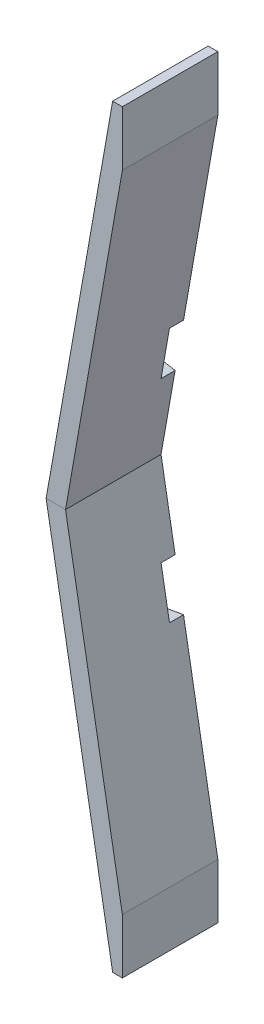
ISO-10303-21;
HEADER;
FILE_DESCRIPTION(('STEP AP214'),'2;1');
FILE_NAME('part.step','',(''),(''),'','','');
FILE_SCHEMA(('AUTOMOTIVE_DESIGN { 1 0 10303 214 1 1 1 1 }'));
ENDSEC;
DATA;
#1=APPLICATION_CONTEXT('core data for automotive mechanical design processes');
#2=APPLICATION_PROTOCOL_DEFINITION('international standard','automotive_design',2000,#1);
#3=PRODUCT_CONTEXT('',#1,'mechanical');
#4=PRODUCT('Part','Part','',(#3));
#5=PRODUCT_RELATED_PRODUCT_CATEGORY('part','',(#4));
#6=PRODUCT_DEFINITION_FORMATION('','',#4);
#7=PRODUCT_DEFINITION_CONTEXT('part definition',#1,'design');
#8=PRODUCT_DEFINITION('design','',#6,#7);
#9=PRODUCT_DEFINITION_SHAPE('','',#8);
#10=(LENGTH_UNIT() NAMED_UNIT(*) SI_UNIT(.MILLI.,.METRE.));
#11=(NAMED_UNIT(*) PLANE_ANGLE_UNIT() SI_UNIT($,.RADIAN.));
#12=(NAMED_UNIT(*) SI_UNIT($,.STERADIAN.) SOLID_ANGLE_UNIT());
#13=UNCERTAINTY_MEASURE_WITH_UNIT(LENGTH_MEASURE(1.E-05),#10,'distance_accuracy_value','');
#14=(GEOMETRIC_REPRESENTATION_CONTEXT(3) GLOBAL_UNCERTAINTY_ASSIGNED_CONTEXT((#13)) GLOBAL_UNIT_ASSIGNED_CONTEXT((#10,
#11,#12)) REPRESENTATION_CONTEXT('',''));
#15=CARTESIAN_POINT('',(0.,0.,0.));
#16=DIRECTION('',(0.,0.,1.));
#17=DIRECTION('',(1.,0.,0.));
#18=AXIS2_PLACEMENT_3D('',#15,#16,#17);
#19=CARTESIAN_POINT('',(-90.8989782521974,0.,-20.));
#20=DIRECTION('',(-0.984807753012208,0.173648177666931,0.));
#21=DIRECTION('',(0.173648177666931,0.984807753012208,0.));
#22=AXIS2_PLACEMENT_3D('',#19,#20,#21);
#23=PLANE('',#22);
#24=DIRECTION('',(0.,0.,1.));
#25=VECTOR('',#24,1.);
#26=CARTESIAN_POINT('',(-87.9530903883168,16.706960285058,-20.));
#27=LINE('',#26,#25);
#28=CARTESIAN_POINT('',(-87.9530903883168,16.706960285058,-20.));
#29=VERTEX_POINT('',#28);
#30=CARTESIAN_POINT('',(-87.9530903883168,16.706960285058,-17.06));
#31=VERTEX_POINT('',#30);
#32=EDGE_CURVE('E177',#29,#31,#27,.T.);
#33=ORIENTED_EDGE('',*,*,#32,.T.);
#34=DIRECTION('',(-0.173648177666931,-0.984807753012208,0.));
#35=VECTOR('',#34,1.);
#36=CARTESIAN_POINT('',(-90.8989782521974,0.,-17.06));
#37=LINE('',#36,#35);
#38=CARTESIAN_POINT('',(-86.1888249032208,26.712607055662,-17.06));
#39=VERTEX_POINT('',#38);
#40=EDGE_CURVE('E140',#39,#31,#37,.T.);
#41=ORIENTED_EDGE('',*,*,#40,.F.);
#42=DIRECTION('',(0.,0.,-1.));
#43=VECTOR('',#42,1.);
#44=CARTESIAN_POINT('',(-86.1888249032208,26.712607055662,-20.));
#45=LINE('',#44,#43);
#46=CARTESIAN_POINT('',(-86.1888249032208,26.712607055662,-20.));
#47=VERTEX_POINT('',#46);
#48=EDGE_CURVE('E128',#39,#47,#45,.T.);
#49=ORIENTED_EDGE('',*,*,#48,.T.);
#50=DIRECTION('',(0.173648177666931,0.984807753012208,0.));
#51=VECTOR('',#50,1.);
#52=CARTESIAN_POINT('',(-90.8989782521974,0.,-20.));
#53=LINE('',#52,#51);
#54=CARTESIAN_POINT('',(-79.,67.4824590337129,-20.));
#55=VERTEX_POINT('',#54);
#56=EDGE_CURVE('E110',#47,#55,#53,.T.);
#57=ORIENTED_EDGE('',*,*,#56,.T.);
#58=DIRECTION('',(0.,0.,1.));
#59=VECTOR('',#58,1.);
#60=CARTESIAN_POINT('',(-79.,67.4824590337129,-20.));
#61=LINE('',#60,#59);
#62=CARTESIAN_POINT('',(-79.,67.4824590337129,0.));
#63=VERTEX_POINT('',#62);
#64=EDGE_CURVE('E117',#55,#63,#61,.T.);
#65=ORIENTED_EDGE('',*,*,#64,.T.);
#66=DIRECTION('',(0.173648177666931,0.984807753012208,0.));
#67=VECTOR('',#66,1.);
#68=CARTESIAN_POINT('',(-90.8989782521974,0.,0.));
#69=LINE('',#68,#67);
#70=CARTESIAN_POINT('',(-90.8989782521974,0.,0.));
#71=VERTEX_POINT('',#70);
#72=EDGE_CURVE('E139',#71,#63,#69,.T.);
#73=ORIENTED_EDGE('',*,*,#72,.F.);
#74=DIRECTION('',(0.,0.,1.));
#75=VECTOR('',#74,1.);
#76=CARTESIAN_POINT('',(-90.8989782521974,0.,-20.));
#77=LINE('',#76,#75);
#78=CARTESIAN_POINT('',(-90.8989782521974,0.,-20.));
#79=VERTEX_POINT('',#78);
#80=EDGE_CURVE('E123',#79,#71,#77,.T.);
#81=ORIENTED_EDGE('',*,*,#80,.F.);
#82=EDGE_CURVE('E114',#79,#29,#53,.T.);
#83=ORIENTED_EDGE('',*,*,#82,.T.);
#84=EDGE_LOOP('',(#33,#41,#49,#57,#65,#73,#81,#83));
#85=FACE_BOUND('',#84,.T.);
#86=ADVANCED_FACE('F43',(#85),#23,.F.);
#87=CARTESIAN_POINT('',(-94.8994469819932,0.347296355333863,-20.));
#88=DIRECTION('',(-0.984807753012207,0.173648177666936,0.));
#89=DIRECTION('',(0.173648177666936,0.984807753012207,0.));
#90=AXIS2_PLACEMENT_3D('',#87,#88,#89);
#91=PLANE('',#90);
#92=DIRECTION('',(-0.173648177666936,-0.984807753012207,0.));
#93=VECTOR('',#92,1.);
#94=CARTESIAN_POINT('',(-94.8994469819932,0.347296355333863,-20.));
#95=LINE('',#94,#93);
#96=CARTESIAN_POINT('',(-91.8923214003656,17.4015529957257,-20.));
#97=VERTEX_POINT('',#96);
#98=CARTESIAN_POINT('',(-94.9606846997403,0.,-20.));
#99=VERTEX_POINT('',#98);
#100=EDGE_CURVE('E147',#97,#99,#95,.T.);
#101=ORIENTED_EDGE('',*,*,#100,.T.);
#102=DIRECTION('',(0.,0.,1.));
#103=VECTOR('',#102,1.);
#104=CARTESIAN_POINT('',(-94.9606846997403,0.,-20.));
#105=LINE('',#104,#103);
#106=CARTESIAN_POINT('',(-94.9606846997403,0.,0.));
#107=VERTEX_POINT('',#106);
#108=EDGE_CURVE('E152',#99,#107,#105,.T.);
#109=ORIENTED_EDGE('',*,*,#108,.T.);
#110=DIRECTION('',(0.173648177666936,0.984807753012207,0.));
#111=VECTOR('',#110,1.);
#112=CARTESIAN_POINT('',(-94.8994469819932,0.347296355333863,0.));
#113=LINE('',#112,#111);
#114=CARTESIAN_POINT('',(-81.0308532237711,79.,0.));
#115=VERTEX_POINT('',#114);
#116=EDGE_CURVE('E144',#107,#115,#113,.T.);
#117=ORIENTED_EDGE('',*,*,#116,.T.);
#118=DIRECTION('',(0.,0.,1.));
#119=VECTOR('',#118,1.);
#120=CARTESIAN_POINT('',(-81.0308532237711,79.,-20.));
#121=LINE('',#120,#119);
#122=CARTESIAN_POINT('',(-81.0308532237711,79.,-20.));
#123=VERTEX_POINT('',#122);
#124=EDGE_CURVE('E136',#123,#115,#121,.T.);
#125=ORIENTED_EDGE('',*,*,#124,.F.);
#126=CARTESIAN_POINT('',(-90.1280559152695,27.4071997663298,-20.));
#127=VERTEX_POINT('',#126);
#128=EDGE_CURVE('E131',#123,#127,#95,.T.);
#129=ORIENTED_EDGE('',*,*,#128,.T.);
#130=DIRECTION('',(0.,0.,-1.));
#131=VECTOR('',#130,1.);
#132=CARTESIAN_POINT('',(-90.1280559152695,27.4071997663297,0.));
#133=LINE('',#132,#131);
#134=CARTESIAN_POINT('',(-90.1280559152695,27.4071997663297,-17.06));
#135=VERTEX_POINT('',#134);
#136=EDGE_CURVE('E162',#135,#127,#133,.T.);
#137=ORIENTED_EDGE('',*,*,#136,.F.);
#138=DIRECTION('',(-0.173648177666936,-0.984807753012207,0.));
#139=VECTOR('',#138,1.);
#140=CARTESIAN_POINT('',(-92.0972696884316,16.239233495655,-17.06));
#141=LINE('',#140,#139);
#142=CARTESIAN_POINT('',(-91.8923214003656,17.4015529957257,-17.06));
#143=VERTEX_POINT('',#142);
#144=EDGE_CURVE('E169',#135,#143,#141,.T.);
#145=ORIENTED_EDGE('',*,*,#144,.T.);
#146=DIRECTION('',(0.,0.,1.));
#147=VECTOR('',#146,1.);
#148=CARTESIAN_POINT('',(-91.8923214003656,17.4015529957257,0.));
#149=LINE('',#148,#147);
#150=EDGE_CURVE('E170',#97,#143,#149,.T.);
#151=ORIENTED_EDGE('',*,*,#150,.F.);
#152=EDGE_LOOP('',(#101,#109,#117,#125,#129,#137,#145,#151));
#153=FACE_BOUND('',#152,.T.);
#154=ADVANCED_FACE('F173',(#153),#91,.T.);
#155=CARTESIAN_POINT('',(0.,0.,-20.));
#156=DIRECTION('',(0.,0.,1.));
#157=DIRECTION('',(1.,0.,0.));
#158=AXIS2_PLACEMENT_3D('',#155,#156,#157);
#159=PLANE('',#158);
#160=DIRECTION('',(0.984807753012207,-0.173648177666936,0.));
#161=VECTOR('',#160,1.);
#162=CARTESIAN_POINT('',(0.204948288066057,1.16231950007076,-20.));
#163=LINE('',#162,#161);
#164=EDGE_CURVE('E12',#97,#29,#163,.T.);
#165=ORIENTED_EDGE('',*,*,#164,.T.);
#166=ORIENTED_EDGE('',*,*,#82,.F.);
#167=DIRECTION('',(-1.,0.,0.));
#168=VECTOR('',#167,1.);
#169=CARTESIAN_POINT('',(-92.9298314759688,0.,-20.));
#170=LINE('',#169,#168);
#171=EDGE_CURVE('E98',#79,#99,#170,.T.);
#172=ORIENTED_EDGE('',*,*,#171,.T.);
#173=ORIENTED_EDGE('',*,*,#100,.F.);
#174=EDGE_LOOP('',(#165,#166,#172,#173));
#175=FACE_BOUND('',#174,.T.);
#176=ADVANCED_FACE('F201',(#175),#159,.F.);
#177=DIRECTION('',(-0.984807753012207,0.173648177666936,0.));
#178=VECTOR('',#177,1.);
#179=CARTESIAN_POINT('',(1.96921377316213,11.1679662706748,-20.));
#180=LINE('',#179,#178);
#181=EDGE_CURVE('E51',#47,#127,#180,.T.);
#182=ORIENTED_EDGE('',*,*,#181,.T.);
#183=ORIENTED_EDGE('',*,*,#128,.F.);
#184=DIRECTION('',(-1.,0.,0.));
#185=VECTOR('',#184,1.);
#186=CARTESIAN_POINT('',(-79.,79.,-20.));
#187=LINE('',#186,#185);
#188=CARTESIAN_POINT('',(-79.,79.,-20.));
#189=VERTEX_POINT('',#188);
#190=EDGE_CURVE('E66',#189,#123,#187,.T.);
#191=ORIENTED_EDGE('',*,*,#190,.F.);
#192=DIRECTION('',(0.,1.,0.));
#193=VECTOR('',#192,1.);
#194=CARTESIAN_POINT('',(-79.,67.4824590337129,-20.));
#195=LINE('',#194,#193);
#196=EDGE_CURVE('E106',#55,#189,#195,.T.);
#197=ORIENTED_EDGE('',*,*,#196,.F.);
#198=ORIENTED_EDGE('',*,*,#56,.F.);
#199=EDGE_LOOP('',(#182,#183,#191,#197,#198));
#200=FACE_BOUND('',#199,.T.);
#201=ADVANCED_FACE('F108',(#200),#159,.F.);
#202=CARTESIAN_POINT('',(-92.9298314759688,0.,-20.));
#203=DIRECTION('',(0.,1.,0.));
#204=DIRECTION('',(0.,0.,-1.));
#205=AXIS2_PLACEMENT_3D('',#202,#203,#204);
#206=PLANE('',#205);
#207=DIRECTION('',(1.,0.,0.));
#208=VECTOR('',#207,1.);
#209=CARTESIAN_POINT('',(-92.9298314759688,0.,0.));
#210=LINE('',#209,#208);
#211=EDGE_CURVE('E137',#107,#71,#210,.T.);
#212=ORIENTED_EDGE('',*,*,#211,.F.);
#213=ORIENTED_EDGE('',*,*,#108,.F.);
#214=ORIENTED_EDGE('',*,*,#171,.F.);
#215=ORIENTED_EDGE('',*,*,#80,.T.);
#216=EDGE_LOOP('',(#212,#213,#214,#215));
#217=FACE_BOUND('',#216,.T.);
#218=ADVANCED_FACE('F45',(#217),#206,.F.);
#219=CARTESIAN_POINT('',(-79.,67.4824590337129,-20.));
#220=DIRECTION('',(-1.,0.,0.));
#221=DIRECTION('',(0.,1.,0.));
#222=AXIS2_PLACEMENT_3D('',#219,#220,#221);
#223=PLANE('',#222);
#224=DIRECTION('',(0.,1.,0.));
#225=VECTOR('',#224,1.);
#226=CARTESIAN_POINT('',(-79.,67.4824590337129,0.));
#227=LINE('',#226,#225);
#228=CARTESIAN_POINT('',(-79.,79.,0.));
#229=VERTEX_POINT('',#228);
#230=EDGE_CURVE('E119',#63,#229,#227,.T.);
#231=ORIENTED_EDGE('',*,*,#230,.F.);
#232=ORIENTED_EDGE('',*,*,#64,.F.);
#233=ORIENTED_EDGE('',*,*,#196,.T.);
#234=DIRECTION('',(0.,0.,1.));
#235=VECTOR('',#234,1.);
#236=CARTESIAN_POINT('',(-79.,79.,-20.));
#237=LINE('',#236,#235);
#238=EDGE_CURVE('E124',#189,#229,#237,.T.);
#239=ORIENTED_EDGE('',*,*,#238,.T.);
#240=EDGE_LOOP('',(#231,#232,#233,#239));
#241=FACE_BOUND('',#240,.T.);
#242=ADVANCED_FACE('F118',(#241),#223,.F.);
#243=CARTESIAN_POINT('',(-79.,79.,-20.));
#244=DIRECTION('',(0.,-1.,0.));
#245=DIRECTION('',(-1.,0.,0.));
#246=AXIS2_PLACEMENT_3D('',#243,#244,#245);
#247=PLANE('',#246);
#248=DIRECTION('',(-1.,0.,0.));
#249=VECTOR('',#248,1.);
#250=CARTESIAN_POINT('',(-79.,79.,0.));
#251=LINE('',#250,#249);
#252=EDGE_CURVE('E90',#229,#115,#251,.T.);
#253=ORIENTED_EDGE('',*,*,#252,.F.);
#254=ORIENTED_EDGE('',*,*,#238,.F.);
#255=ORIENTED_EDGE('',*,*,#190,.T.);
#256=ORIENTED_EDGE('',*,*,#124,.T.);
#257=EDGE_LOOP('',(#253,#254,#255,#256));
#258=FACE_BOUND('',#257,.T.);
#259=ADVANCED_FACE('F206',(#258),#247,.F.);
#260=CARTESIAN_POINT('',(0.,0.,0.));
#261=DIRECTION('',(0.,0.,1.));
#262=DIRECTION('',(1.,0.,0.));
#263=AXIS2_PLACEMENT_3D('',#260,#261,#262);
#264=PLANE('',#263);
#265=ORIENTED_EDGE('',*,*,#211,.T.);
#266=ORIENTED_EDGE('',*,*,#72,.T.);
#267=ORIENTED_EDGE('',*,*,#230,.T.);
#268=ORIENTED_EDGE('',*,*,#252,.T.);
#269=ORIENTED_EDGE('',*,*,#116,.F.);
#270=EDGE_LOOP('',(#265,#266,#267,#268,#269));
#271=FACE_BOUND('',#270,.T.);
#272=ADVANCED_FACE('F204',(#271),#264,.T.);
#273=CARTESIAN_POINT('',(-76.6178585210432,13.5097956613644,-17.06));
#274=DIRECTION('',(0.,0.,1.));
#275=DIRECTION('',(1.,0.,0.));
#276=AXIS2_PLACEMENT_3D('',#273,#274,#275);
#277=PLANE('',#276);
#278=DIRECTION('',(-0.984807753012207,0.173648177666936,0.));
#279=VECTOR('',#278,1.);
#280=CARTESIAN_POINT('',(-74.6486447478811,24.6777619320392,-17.06));
#281=LINE('',#280,#279);
#282=EDGE_CURVE('E165',#39,#135,#281,.T.);
#283=ORIENTED_EDGE('',*,*,#282,.F.);
#284=ORIENTED_EDGE('',*,*,#40,.T.);
#285=DIRECTION('',(-0.984807753012207,0.173648177666936,0.));
#286=VECTOR('',#285,1.);
#287=CARTESIAN_POINT('',(-76.4129102329772,14.6721151614351,-17.06));
#288=LINE('',#287,#286);
#289=EDGE_CURVE('E180',#31,#143,#288,.T.);
#290=ORIENTED_EDGE('',*,*,#289,.T.);
#291=ORIENTED_EDGE('',*,*,#144,.F.);
#292=EDGE_LOOP('',(#283,#284,#290,#291));
#293=FACE_BOUND('',#292,.T.);
#294=ADVANCED_FACE('F197',(#293),#277,.F.);
#295=CARTESIAN_POINT('',(-76.4129102329772,14.6721151614351,0.));
#296=DIRECTION('',(0.173648177666936,0.984807753012207,0.));
#297=DIRECTION('',(0.984807753012207,-0.173648177666936,0.));
#298=AXIS2_PLACEMENT_3D('',#295,#296,#297);
#299=PLANE('',#298);
#300=ORIENTED_EDGE('',*,*,#32,.F.);
#301=ORIENTED_EDGE('',*,*,#164,.F.);
#302=ORIENTED_EDGE('',*,*,#150,.T.);
#303=ORIENTED_EDGE('',*,*,#289,.F.);
#304=EDGE_LOOP('',(#300,#301,#302,#303));
#305=FACE_BOUND('',#304,.T.);
#306=ADVANCED_FACE('F192',(#305),#299,.T.);
#307=CARTESIAN_POINT('',(-74.6486447478811,24.6777619320392,0.));
#308=DIRECTION('',(-0.173648177666936,-0.984807753012207,0.));
#309=DIRECTION('',(-0.984807753012207,0.173648177666936,0.));
#310=AXIS2_PLACEMENT_3D('',#307,#308,#309);
#311=PLANE('',#310);
#312=ORIENTED_EDGE('',*,*,#48,.F.);
#313=ORIENTED_EDGE('',*,*,#282,.T.);
#314=ORIENTED_EDGE('',*,*,#136,.T.);
#315=ORIENTED_EDGE('',*,*,#181,.F.);
#316=EDGE_LOOP('',(#312,#313,#314,#315));
#317=FACE_BOUND('',#316,.T.);
#318=ADVANCED_FACE('F163',(#317),#311,.T.);
#319=CLOSED_SHELL('',(#86,#154,#176,#201,#218,#242,#259,#272,#294,#306,#318));
#320=MANIFOLD_SOLID_BREP('B2',#319);
#321=CARTESIAN_POINT('',(-90.8989782521974,0.,-20.));
#322=DIRECTION('',(-0.984807753012208,-0.173648177666931,0.));
#323=DIRECTION('',(0.173648177666931,-0.984807753012208,0.));
#324=AXIS2_PLACEMENT_3D('',#321,#322,#323);
#325=PLANE('',#324);
#326=DIRECTION('',(0.,0.,1.));
#327=VECTOR('',#326,1.);
#328=CARTESIAN_POINT('',(-87.9530903883168,-16.706960285058,-20.));
#329=LINE('',#328,#327);
#330=CARTESIAN_POINT('',(-87.9530903883168,-16.706960285058,-20.));
#331=VERTEX_POINT('',#330);
#332=CARTESIAN_POINT('',(-87.9530903883168,-16.706960285058,-17.06));
#333=VERTEX_POINT('',#332);
#334=EDGE_CURVE('E435',#331,#333,#329,.T.);
#335=ORIENTED_EDGE('',*,*,#334,.F.);
#336=DIRECTION('',(0.173648177666931,-0.984807753012208,0.));
#337=VECTOR('',#336,1.);
#338=CARTESIAN_POINT('',(-90.8989782521974,0.,-20.));
#339=LINE('',#338,#337);
#340=CARTESIAN_POINT('',(-90.8989782521974,0.,-20.));
#341=VERTEX_POINT('',#340);
#342=EDGE_CURVE('E377',#341,#331,#339,.T.);
#343=ORIENTED_EDGE('',*,*,#342,.F.);
#344=DIRECTION('',(0.,0.,1.));
#345=VECTOR('',#344,1.);
#346=CARTESIAN_POINT('',(-90.8989782521974,0.,-20.));
#347=LINE('',#346,#345);
#348=CARTESIAN_POINT('',(-90.8989782521974,0.,0.));
#349=VERTEX_POINT('',#348);
#350=EDGE_CURVE('E388',#341,#349,#347,.T.);
#351=ORIENTED_EDGE('',*,*,#350,.T.);
#352=DIRECTION('',(0.173648177666931,-0.984807753012208,0.));
#353=VECTOR('',#352,1.);
#354=CARTESIAN_POINT('',(-90.8989782521974,0.,0.));
#355=LINE('',#354,#353);
#356=CARTESIAN_POINT('',(-79.,-67.4824590337129,0.));
#357=VERTEX_POINT('',#356);
#358=EDGE_CURVE('E385',#349,#357,#355,.T.);
#359=ORIENTED_EDGE('',*,*,#358,.T.);
#360=DIRECTION('',(0.,0.,1.));
#361=VECTOR('',#360,1.);
#362=CARTESIAN_POINT('',(-79.,-67.4824590337129,-20.));
#363=LINE('',#362,#361);
#364=CARTESIAN_POINT('',(-79.,-67.4824590337129,-20.));
#365=VERTEX_POINT('',#364);
#366=EDGE_CURVE('E381',#365,#357,#363,.T.);
#367=ORIENTED_EDGE('',*,*,#366,.F.);
#368=CARTESIAN_POINT('',(-86.1888249032208,-26.712607055662,-20.));
#369=VERTEX_POINT('',#368);
#370=EDGE_CURVE('E370',#369,#365,#339,.T.);
#371=ORIENTED_EDGE('',*,*,#370,.F.);
#372=DIRECTION('',(0.,0.,-1.));
#373=VECTOR('',#372,1.);
#374=CARTESIAN_POINT('',(-86.1888249032208,-26.712607055662,-20.));
#375=LINE('',#374,#373);
#376=CARTESIAN_POINT('',(-86.1888249032208,-26.712607055662,-17.06));
#377=VERTEX_POINT('',#376);
#378=EDGE_CURVE('E321',#377,#369,#375,.T.);
#379=ORIENTED_EDGE('',*,*,#378,.F.);
#380=DIRECTION('',(-0.173648177666931,0.984807753012208,0.));
#381=VECTOR('',#380,1.);
#382=CARTESIAN_POINT('',(-90.8989782521974,0.,-17.06));
#383=LINE('',#382,#381);
#384=EDGE_CURVE('E402',#377,#333,#383,.T.);
#385=ORIENTED_EDGE('',*,*,#384,.T.);
#386=EDGE_LOOP('',(#335,#343,#351,#359,#367,#371,#379,#385));
#387=FACE_BOUND('',#386,.T.);
#388=ADVANCED_FACE('F306',(#387),#325,.F.);
#389=CARTESIAN_POINT('',(-94.8994469819932,-0.347296355333863,-20.));
#390=DIRECTION('',(-0.984807753012207,-0.173648177666936,0.));
#391=DIRECTION('',(0.173648177666936,-0.984807753012207,0.));
#392=AXIS2_PLACEMENT_3D('',#389,#390,#391);
#393=PLANE('',#392);
#394=DIRECTION('',(-0.173648177666936,0.984807753012207,0.));
#395=VECTOR('',#394,1.);
#396=CARTESIAN_POINT('',(-94.8994469819932,-0.347296355333863,-20.));
#397=LINE('',#396,#395);
#398=CARTESIAN_POINT('',(-91.8923214003656,-17.4015529957257,-20.));
#399=VERTEX_POINT('',#398);
#400=CARTESIAN_POINT('',(-94.9606846997403,0.,-20.));
#401=VERTEX_POINT('',#400);
#402=EDGE_CURVE('E362',#399,#401,#397,.T.);
#403=ORIENTED_EDGE('',*,*,#402,.F.);
#404=DIRECTION('',(0.,0.,1.));
#405=VECTOR('',#404,1.);
#406=CARTESIAN_POINT('',(-91.8923214003656,-17.4015529957257,0.));
#407=LINE('',#406,#405);
#408=CARTESIAN_POINT('',(-91.8923214003656,-17.4015529957257,-17.06));
#409=VERTEX_POINT('',#408);
#410=EDGE_CURVE('E428',#399,#409,#407,.T.);
#411=ORIENTED_EDGE('',*,*,#410,.T.);
#412=DIRECTION('',(-0.173648177666936,0.984807753012207,0.));
#413=VECTOR('',#412,1.);
#414=CARTESIAN_POINT('',(-92.0972696884316,-16.239233495655,-17.06));
#415=LINE('',#414,#413);
#416=CARTESIAN_POINT('',(-90.1280559152695,-27.4071997663297,-17.06));
#417=VERTEX_POINT('',#416);
#418=EDGE_CURVE('E427',#417,#409,#415,.T.);
#419=ORIENTED_EDGE('',*,*,#418,.F.);
#420=DIRECTION('',(0.,0.,-1.));
#421=VECTOR('',#420,1.);
#422=CARTESIAN_POINT('',(-90.1280559152695,-27.4071997663297,0.));
#423=LINE('',#422,#421);
#424=CARTESIAN_POINT('',(-90.1280559152695,-27.4071997663298,-20.));
#425=VERTEX_POINT('',#424);
#426=EDGE_CURVE('E420',#417,#425,#423,.T.);
#427=ORIENTED_EDGE('',*,*,#426,.T.);
#428=CARTESIAN_POINT('',(-81.0308532237711,-79.,-20.));
#429=VERTEX_POINT('',#428);
#430=EDGE_CURVE('E330',#429,#425,#397,.T.);
#431=ORIENTED_EDGE('',*,*,#430,.F.);
#432=DIRECTION('',(0.,0.,1.));
#433=VECTOR('',#432,1.);
#434=CARTESIAN_POINT('',(-81.0308532237711,-79.,-20.));
#435=LINE('',#434,#433);
#436=CARTESIAN_POINT('',(-81.0308532237711,-79.,0.));
#437=VERTEX_POINT('',#436);
#438=EDGE_CURVE('E353',#429,#437,#435,.T.);
#439=ORIENTED_EDGE('',*,*,#438,.T.);
#440=DIRECTION('',(0.173648177666936,-0.984807753012207,0.));
#441=VECTOR('',#440,1.);
#442=CARTESIAN_POINT('',(-94.8994469819932,-0.347296355333863,0.));
#443=LINE('',#442,#441);
#444=CARTESIAN_POINT('',(-94.9606846997403,0.,0.));
#445=VERTEX_POINT('',#444);
#446=EDGE_CURVE('E408',#445,#437,#443,.T.);
#447=ORIENTED_EDGE('',*,*,#446,.F.);
#448=DIRECTION('',(0.,0.,1.));
#449=VECTOR('',#448,1.);
#450=CARTESIAN_POINT('',(-94.9606846997403,0.,-20.));
#451=LINE('',#450,#449);
#452=EDGE_CURVE('E414',#401,#445,#451,.T.);
#453=ORIENTED_EDGE('',*,*,#452,.F.);
#454=EDGE_LOOP('',(#403,#411,#419,#427,#431,#439,#447,#453));
#455=FACE_BOUND('',#454,.T.);
#456=ADVANCED_FACE('F424',(#455),#393,.T.);
#457=CARTESIAN_POINT('',(0.,0.,-20.));
#458=DIRECTION('',(0.,0.,1.));
#459=DIRECTION('',(1.,0.,0.));
#460=AXIS2_PLACEMENT_3D('',#457,#458,#459);
#461=PLANE('',#460);
#462=DIRECTION('',(0.984807753012207,0.173648177666936,0.));
#463=VECTOR('',#462,1.);
#464=CARTESIAN_POINT('',(0.204948288066057,-1.16231950007076,-20.));
#465=LINE('',#464,#463);
#466=EDGE_CURVE('E41',#399,#331,#465,.T.);
#467=ORIENTED_EDGE('',*,*,#466,.F.);
#468=ORIENTED_EDGE('',*,*,#402,.T.);
#469=DIRECTION('',(-1.,0.,0.));
#470=VECTOR('',#469,1.);
#471=CARTESIAN_POINT('',(-92.9298314759688,0.,-20.));
#472=LINE('',#471,#470);
#473=EDGE_CURVE('E378',#341,#401,#472,.T.);
#474=ORIENTED_EDGE('',*,*,#473,.F.);
#475=ORIENTED_EDGE('',*,*,#342,.T.);
#476=EDGE_LOOP('',(#467,#468,#474,#475));
#477=FACE_BOUND('',#476,.T.);
#478=ADVANCED_FACE('F454',(#477),#461,.F.);
#479=DIRECTION('',(-0.984807753012207,-0.173648177666936,0.));
#480=VECTOR('',#479,1.);
#481=CARTESIAN_POINT('',(1.96921377316213,-11.1679662706748,-20.));
#482=LINE('',#481,#480);
#483=EDGE_CURVE('E314',#369,#425,#482,.T.);
#484=ORIENTED_EDGE('',*,*,#483,.F.);
#485=ORIENTED_EDGE('',*,*,#370,.T.);
#486=DIRECTION('',(0.,-1.,0.));
#487=VECTOR('',#486,1.);
#488=CARTESIAN_POINT('',(-79.,-67.4824590337129,-20.));
#489=LINE('',#488,#487);
#490=CARTESIAN_POINT('',(-79.,-79.,-20.));
#491=VERTEX_POINT('',#490);
#492=EDGE_CURVE('E374',#365,#491,#489,.T.);
#493=ORIENTED_EDGE('',*,*,#492,.T.);
#494=DIRECTION('',(-1.,0.,0.));
#495=VECTOR('',#494,1.);
#496=CARTESIAN_POINT('',(-79.,-79.,-20.));
#497=LINE('',#496,#495);
#498=EDGE_CURVE('E394',#491,#429,#497,.T.);
#499=ORIENTED_EDGE('',*,*,#498,.T.);
#500=ORIENTED_EDGE('',*,*,#430,.T.);
#501=EDGE_LOOP('',(#484,#485,#493,#499,#500));
#502=FACE_BOUND('',#501,.T.);
#503=ADVANCED_FACE('F372',(#502),#461,.F.);
#504=CARTESIAN_POINT('',(-92.9298314759688,0.,-20.));
#505=DIRECTION('',(0.,-1.,0.));
#506=DIRECTION('',(0.,0.,-1.));
#507=AXIS2_PLACEMENT_3D('',#504,#505,#506);
#508=PLANE('',#507);
#509=DIRECTION('',(1.,0.,0.));
#510=VECTOR('',#509,1.);
#511=CARTESIAN_POINT('',(-92.9298314759688,0.,0.));
#512=LINE('',#511,#510);
#513=EDGE_CURVE('E400',#445,#349,#512,.T.);
#514=ORIENTED_EDGE('',*,*,#513,.T.);
#515=ORIENTED_EDGE('',*,*,#350,.F.);
#516=ORIENTED_EDGE('',*,*,#473,.T.);
#517=ORIENTED_EDGE('',*,*,#452,.T.);
#518=EDGE_LOOP('',(#514,#515,#516,#517));
#519=FACE_BOUND('',#518,.T.);
#520=ADVANCED_FACE('F308',(#519),#508,.F.);
#521=CARTESIAN_POINT('',(-79.,-67.4824590337129,-20.));
#522=DIRECTION('',(-1.,0.,0.));
#523=DIRECTION('',(0.,-1.,0.));
#524=AXIS2_PLACEMENT_3D('',#521,#522,#523);
#525=PLANE('',#524);
#526=DIRECTION('',(0.,-1.,0.));
#527=VECTOR('',#526,1.);
#528=CARTESIAN_POINT('',(-79.,-67.4824590337129,0.));
#529=LINE('',#528,#527);
#530=CARTESIAN_POINT('',(-79.,-79.,0.));
#531=VERTEX_POINT('',#530);
#532=EDGE_CURVE('E404',#357,#531,#529,.T.);
#533=ORIENTED_EDGE('',*,*,#532,.T.);
#534=DIRECTION('',(0.,0.,1.));
#535=VECTOR('',#534,1.);
#536=CARTESIAN_POINT('',(-79.,-79.,-20.));
#537=LINE('',#536,#535);
#538=EDGE_CURVE('E389',#491,#531,#537,.T.);
#539=ORIENTED_EDGE('',*,*,#538,.F.);
#540=ORIENTED_EDGE('',*,*,#492,.F.);
#541=ORIENTED_EDGE('',*,*,#366,.T.);
#542=EDGE_LOOP('',(#533,#539,#540,#541));
#543=FACE_BOUND('',#542,.T.);
#544=ADVANCED_FACE('F391',(#543),#525,.F.);
#545=CARTESIAN_POINT('',(-79.,-79.,-20.));
#546=DIRECTION('',(0.,1.,0.));
#547=DIRECTION('',(-1.,0.,0.));
#548=AXIS2_PLACEMENT_3D('',#545,#546,#547);
#549=PLANE('',#548);
#550=DIRECTION('',(-1.,0.,0.));
#551=VECTOR('',#550,1.);
#552=CARTESIAN_POINT('',(-79.,-79.,0.));
#553=LINE('',#552,#551);
#554=EDGE_CURVE('E406',#531,#437,#553,.T.);
#555=ORIENTED_EDGE('',*,*,#554,.T.);
#556=ORIENTED_EDGE('',*,*,#438,.F.);
#557=ORIENTED_EDGE('',*,*,#498,.F.);
#558=ORIENTED_EDGE('',*,*,#538,.T.);
#559=EDGE_LOOP('',(#555,#556,#557,#558));
#560=FACE_BOUND('',#559,.T.);
#561=ADVANCED_FACE('F471',(#560),#549,.F.);
#562=CARTESIAN_POINT('',(0.,0.,0.));
#563=DIRECTION('',(0.,0.,1.));
#564=DIRECTION('',(1.,0.,0.));
#565=AXIS2_PLACEMENT_3D('',#562,#563,#564);
#566=PLANE('',#565);
#567=ORIENTED_EDGE('',*,*,#513,.F.);
#568=ORIENTED_EDGE('',*,*,#446,.T.);
#569=ORIENTED_EDGE('',*,*,#554,.F.);
#570=ORIENTED_EDGE('',*,*,#532,.F.);
#571=ORIENTED_EDGE('',*,*,#358,.F.);
#572=EDGE_LOOP('',(#567,#568,#569,#570,#571));
#573=FACE_BOUND('',#572,.T.);
#574=ADVANCED_FACE('F464',(#573),#566,.T.);
#575=CARTESIAN_POINT('',(-76.6178585210432,-13.5097956613644,-17.06));
#576=DIRECTION('',(0.,0.,1.));
#577=DIRECTION('',(1.,0.,0.));
#578=AXIS2_PLACEMENT_3D('',#575,#576,#577);
#579=PLANE('',#578);
#580=DIRECTION('',(-0.984807753012207,-0.173648177666936,0.));
#581=VECTOR('',#580,1.);
#582=CARTESIAN_POINT('',(-74.6486447478811,-24.6777619320392,-17.06));
#583=LINE('',#582,#581);
#584=EDGE_CURVE('E440',#377,#417,#583,.T.);
#585=ORIENTED_EDGE('',*,*,#584,.T.);
#586=ORIENTED_EDGE('',*,*,#418,.T.);
#587=DIRECTION('',(-0.984807753012207,-0.173648177666936,0.));
#588=VECTOR('',#587,1.);
#589=CARTESIAN_POINT('',(-76.4129102329772,-14.6721151614351,-17.06));
#590=LINE('',#589,#588);
#591=EDGE_CURVE('E439',#333,#409,#590,.T.);
#592=ORIENTED_EDGE('',*,*,#591,.F.);
#593=ORIENTED_EDGE('',*,*,#384,.F.);
#594=EDGE_LOOP('',(#585,#586,#592,#593));
#595=FACE_BOUND('',#594,.T.);
#596=ADVANCED_FACE('F460',(#595),#579,.F.);
#597=CARTESIAN_POINT('',(-76.4129102329772,-14.6721151614351,0.));
#598=DIRECTION('',(0.173648177666936,-0.984807753012207,0.));
#599=DIRECTION('',(0.984807753012207,0.173648177666936,0.));
#600=AXIS2_PLACEMENT_3D('',#597,#598,#599);
#601=PLANE('',#600);
#602=ORIENTED_EDGE('',*,*,#334,.T.);
#603=ORIENTED_EDGE('',*,*,#591,.T.);
#604=ORIENTED_EDGE('',*,*,#410,.F.);
#605=ORIENTED_EDGE('',*,*,#466,.T.);
#606=EDGE_LOOP('',(#602,#603,#604,#605));
#607=FACE_BOUND('',#606,.T.);
#608=ADVANCED_FACE('F451',(#607),#601,.T.);
#609=CARTESIAN_POINT('',(-74.6486447478811,-24.6777619320392,0.));
#610=DIRECTION('',(-0.173648177666936,0.984807753012207,0.));
#611=DIRECTION('',(-0.984807753012207,-0.173648177666936,0.));
#612=AXIS2_PLACEMENT_3D('',#609,#610,#611);
#613=PLANE('',#612);
#614=ORIENTED_EDGE('',*,*,#378,.T.);
#615=ORIENTED_EDGE('',*,*,#483,.T.);
#616=ORIENTED_EDGE('',*,*,#426,.F.);
#617=ORIENTED_EDGE('',*,*,#584,.F.);
#618=EDGE_LOOP('',(#614,#615,#616,#617));
#619=FACE_BOUND('',#618,.T.);
#620=ADVANCED_FACE('F418',(#619),#613,.T.);
#621=CLOSED_SHELL('',(#388,#456,#478,#503,#520,#544,#561,#574,#596,#608,#620));
#622=MANIFOLD_SOLID_BREP('B6',#621);
#623=ADVANCED_BREP_SHAPE_REPRESENTATION('',(#18,#320,#622),#14);
#624=SHAPE_DEFINITION_REPRESENTATION(#9,#623);
ENDSEC;
END-ISO-10303-21;
